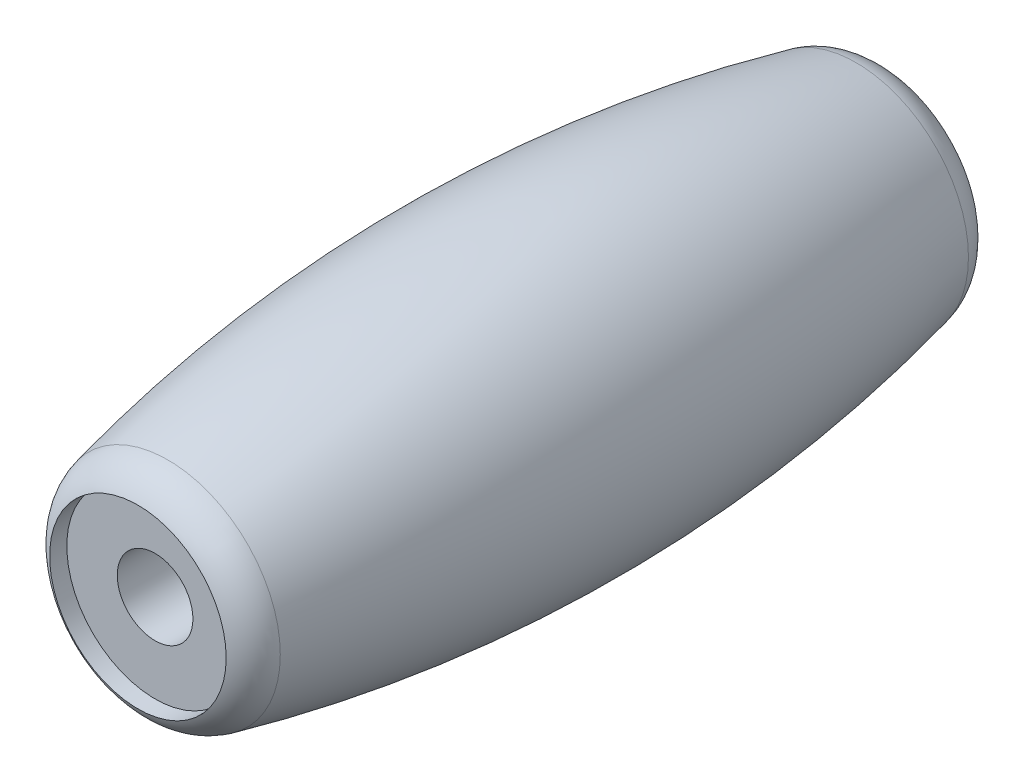
ISO-10303-21;
HEADER;
FILE_DESCRIPTION(('STEP AP214'),'2;1');
FILE_NAME('part.step','',(''),(''),'','','');
FILE_SCHEMA(('AUTOMOTIVE_DESIGN { 1 0 10303 214 1 1 1 1 }'));
ENDSEC;
DATA;
#1=APPLICATION_CONTEXT('core data for automotive mechanical design processes');
#2=APPLICATION_PROTOCOL_DEFINITION('international standard','automotive_design',2000,#1);
#3=PRODUCT_CONTEXT('',#1,'mechanical');
#4=PRODUCT('Part','Part','',(#3));
#5=PRODUCT_RELATED_PRODUCT_CATEGORY('part','',(#4));
#6=PRODUCT_DEFINITION_FORMATION('','',#4);
#7=PRODUCT_DEFINITION_CONTEXT('part definition',#1,'design');
#8=PRODUCT_DEFINITION('design','',#6,#7);
#9=PRODUCT_DEFINITION_SHAPE('','',#8);
#10=(LENGTH_UNIT() NAMED_UNIT(*) SI_UNIT(.MILLI.,.METRE.));
#11=(NAMED_UNIT(*) PLANE_ANGLE_UNIT() SI_UNIT($,.RADIAN.));
#12=(NAMED_UNIT(*) SI_UNIT($,.STERADIAN.) SOLID_ANGLE_UNIT());
#13=UNCERTAINTY_MEASURE_WITH_UNIT(LENGTH_MEASURE(1.E-05),#10,'distance_accuracy_value','');
#14=(GEOMETRIC_REPRESENTATION_CONTEXT(3) GLOBAL_UNCERTAINTY_ASSIGNED_CONTEXT((#13)) GLOBAL_UNIT_ASSIGNED_CONTEXT((#10,
#11,#12)) REPRESENTATION_CONTEXT('',''));
#15=CARTESIAN_POINT('',(0.,0.,0.));
#16=DIRECTION('',(0.,0.,1.));
#17=DIRECTION('',(1.,0.,0.));
#18=AXIS2_PLACEMENT_3D('',#15,#16,#17);
#19=CARTESIAN_POINT('',(0.,0.,13.25));
#20=DIRECTION('',(0.,0.,1.));
#21=DIRECTION('',(1.,0.,0.));
#22=AXIS2_PLACEMENT_3D('',#19,#20,#21);
#23=TOROIDAL_SURFACE('',#22,2.75000000000001,1.75000000000002);
#24=CARTESIAN_POINT('',(0.,0.,14.8311388300842));
#25=DIRECTION('',(0.,0.,1.));
#26=DIRECTION('',(1.,0.,0.));
#27=AXIS2_PLACEMENT_3D('',#24,#25,#26);
#28=CIRCLE('',#27,3.5);
#29=CARTESIAN_POINT('',(3.5,0.,14.8311388300842));
#30=VERTEX_POINT('',#29);
#31=EDGE_CURVE('E69',#30,#30,#28,.T.);
#32=ORIENTED_EDGE('',*,*,#31,.F.);
#33=EDGE_LOOP('',(#32));
#34=FACE_BOUND('',#33,.T.);
#35=CARTESIAN_POINT('',(0.,0.,13.6412126537786));
#36=DIRECTION('',(0.,0.,1.));
#37=DIRECTION('',(1.,0.,0.));
#38=AXIS2_PLACEMENT_3D('',#35,#36,#37);
#39=CIRCLE('',#38,4.45571177504395);
#40=CARTESIAN_POINT('',(4.45571177504395,0.,13.6412126537786));
#41=VERTEX_POINT('',#40);
#42=EDGE_CURVE('E10',#41,#41,#39,.T.);
#43=ORIENTED_EDGE('',*,*,#42,.T.);
#44=EDGE_LOOP('',(#43));
#45=FACE_BOUND('',#44,.T.);
#46=ADVANCED_FACE('F41',(#34,#45),#23,.T.);
#47=CARTESIAN_POINT('',(0.,0.,0.));
#48=DIRECTION('',(0.,0.,1.));
#49=DIRECTION('',(1.,0.,0.));
#50=AXIS2_PLACEMENT_3D('',#47,#48,#49);
#51=DEGENERATE_TOROIDAL_SURFACE('',#50,55.0208333333333,61.0208333333334,.F.);
#52=ORIENTED_EDGE('',*,*,#42,.F.);
#53=EDGE_LOOP('',(#52));
#54=FACE_BOUND('',#53,.T.);
#55=CARTESIAN_POINT('',(0.,0.,-13.6412126537786));
#56=DIRECTION('',(0.,0.,1.));
#57=DIRECTION('',(1.,0.,0.));
#58=AXIS2_PLACEMENT_3D('',#55,#56,#57);
#59=CIRCLE('',#58,4.45571177504395);
#60=CARTESIAN_POINT('',(4.45571177504395,0.,-13.6412126537786));
#61=VERTEX_POINT('',#60);
#62=EDGE_CURVE('E50',#61,#61,#59,.T.);
#63=ORIENTED_EDGE('',*,*,#62,.T.);
#64=EDGE_LOOP('',(#63));
#65=FACE_BOUND('',#64,.T.);
#66=ADVANCED_FACE('F78',(#54,#65),#51,.F.);
#67=CARTESIAN_POINT('',(0.,0.,-13.25));
#68=DIRECTION('',(0.,0.,1.));
#69=DIRECTION('',(1.,0.,0.));
#70=AXIS2_PLACEMENT_3D('',#67,#68,#69);
#71=TOROIDAL_SURFACE('',#70,2.74999999999999,1.75000000000003);
#72=ORIENTED_EDGE('',*,*,#62,.F.);
#73=EDGE_LOOP('',(#72));
#74=FACE_BOUND('',#73,.T.);
#75=CARTESIAN_POINT('',(0.,0.,-14.8311388300842));
#76=DIRECTION('',(0.,0.,1.));
#77=DIRECTION('',(1.,0.,0.));
#78=AXIS2_PLACEMENT_3D('',#75,#76,#77);
#79=CIRCLE('',#78,3.5);
#80=CARTESIAN_POINT('',(3.5,0.,-14.8311388300842));
#81=VERTEX_POINT('',#80);
#82=EDGE_CURVE('E51',#81,#81,#79,.T.);
#83=ORIENTED_EDGE('',*,*,#82,.T.);
#84=EDGE_LOOP('',(#83));
#85=FACE_BOUND('',#84,.T.);
#86=ADVANCED_FACE('F79',(#74,#85),#71,.T.);
#87=CARTESIAN_POINT('',(0.,0.,15.));
#88=DIRECTION('',(0.,0.,1.));
#89=DIRECTION('',(1.,0.,0.));
#90=AXIS2_PLACEMENT_3D('',#87,#88,#89);
#91=CYLINDRICAL_SURFACE('',#90,3.5);
#92=ORIENTED_EDGE('',*,*,#82,.F.);
#93=EDGE_LOOP('',(#92));
#94=FACE_BOUND('',#93,.T.);
#95=CARTESIAN_POINT('',(0.,0.,-14.15));
#96=DIRECTION('',(0.,0.,1.));
#97=DIRECTION('',(1.,0.,0.));
#98=AXIS2_PLACEMENT_3D('',#95,#96,#97);
#99=CIRCLE('',#98,3.5);
#100=CARTESIAN_POINT('',(3.5,0.,-14.15));
#101=VERTEX_POINT('',#100);
#102=EDGE_CURVE('E54',#101,#101,#99,.T.);
#103=ORIENTED_EDGE('',*,*,#102,.T.);
#104=EDGE_LOOP('',(#103));
#105=FACE_BOUND('',#104,.T.);
#106=ADVANCED_FACE('F82',(#94,#105),#91,.F.);
#107=CARTESIAN_POINT('',(0.,1.5,-14.15));
#108=DIRECTION('',(0.,0.,1.));
#109=DIRECTION('',(1.,0.,0.));
#110=AXIS2_PLACEMENT_3D('',#107,#108,#109);
#111=PLANE('',#110);
#112=ORIENTED_EDGE('',*,*,#102,.F.);
#113=EDGE_LOOP('',(#112));
#114=FACE_BOUND('',#113,.T.);
#115=CARTESIAN_POINT('',(0.,0.,-14.15));
#116=DIRECTION('',(0.,0.,1.));
#117=DIRECTION('',(1.,0.,0.));
#118=AXIS2_PLACEMENT_3D('',#115,#116,#117);
#119=CIRCLE('',#118,1.5);
#120=CARTESIAN_POINT('',(1.5,0.,-14.15));
#121=VERTEX_POINT('',#120);
#122=EDGE_CURVE('E58',#121,#121,#119,.T.);
#123=ORIENTED_EDGE('',*,*,#122,.T.);
#124=EDGE_LOOP('',(#123));
#125=FACE_BOUND('',#124,.T.);
#126=ADVANCED_FACE('F91',(#114,#125),#111,.F.);
#127=CARTESIAN_POINT('',(0.,0.,15.));
#128=DIRECTION('',(0.,0.,1.));
#129=DIRECTION('',(1.,0.,0.));
#130=AXIS2_PLACEMENT_3D('',#127,#128,#129);
#131=CYLINDRICAL_SURFACE('',#130,1.5);
#132=ORIENTED_EDGE('',*,*,#122,.F.);
#133=EDGE_LOOP('',(#132));
#134=FACE_BOUND('',#133,.T.);
#135=CARTESIAN_POINT('',(0.,0.,14.15));
#136=DIRECTION('',(0.,0.,1.));
#137=DIRECTION('',(1.,0.,0.));
#138=AXIS2_PLACEMENT_3D('',#135,#136,#137);
#139=CIRCLE('',#138,1.5);
#140=CARTESIAN_POINT('',(1.5,0.,14.15));
#141=VERTEX_POINT('',#140);
#142=EDGE_CURVE('E64',#141,#141,#139,.T.);
#143=ORIENTED_EDGE('',*,*,#142,.T.);
#144=EDGE_LOOP('',(#143));
#145=FACE_BOUND('',#144,.T.);
#146=ADVANCED_FACE('F94',(#134,#145),#131,.F.);
#147=CARTESIAN_POINT('',(0.,1.5,14.15));
#148=DIRECTION('',(0.,0.,-1.));
#149=DIRECTION('',(-1.,0.,0.));
#150=AXIS2_PLACEMENT_3D('',#147,#148,#149);
#151=PLANE('',#150);
#152=ORIENTED_EDGE('',*,*,#142,.F.);
#153=EDGE_LOOP('',(#152));
#154=FACE_BOUND('',#153,.T.);
#155=CARTESIAN_POINT('',(0.,0.,14.15));
#156=DIRECTION('',(0.,0.,1.));
#157=DIRECTION('',(1.,0.,0.));
#158=AXIS2_PLACEMENT_3D('',#155,#156,#157);
#159=CIRCLE('',#158,3.5);
#160=CARTESIAN_POINT('',(3.5,0.,14.15));
#161=VERTEX_POINT('',#160);
#162=EDGE_CURVE('E67',#161,#161,#159,.T.);
#163=ORIENTED_EDGE('',*,*,#162,.T.);
#164=EDGE_LOOP('',(#163));
#165=FACE_BOUND('',#164,.T.);
#166=ADVANCED_FACE('F98',(#154,#165),#151,.F.);
#167=CARTESIAN_POINT('',(0.,0.,15.));
#168=DIRECTION('',(0.,0.,1.));
#169=DIRECTION('',(1.,0.,0.));
#170=AXIS2_PLACEMENT_3D('',#167,#168,#169);
#171=CYLINDRICAL_SURFACE('',#170,3.5);
#172=ORIENTED_EDGE('',*,*,#162,.F.);
#173=EDGE_LOOP('',(#172));
#174=FACE_BOUND('',#173,.T.);
#175=ORIENTED_EDGE('',*,*,#31,.T.);
#176=EDGE_LOOP('',(#175));
#177=FACE_BOUND('',#176,.T.);
#178=ADVANCED_FACE('F74',(#174,#177),#171,.F.);
#179=CLOSED_SHELL('',(#46,#66,#86,#106,#126,#146,#166,#178));
#180=MANIFOLD_SOLID_BREP('B2',#179);
#181=ADVANCED_BREP_SHAPE_REPRESENTATION('',(#18,#180),#14);
#182=SHAPE_DEFINITION_REPRESENTATION(#9,#181);
ENDSEC;
END-ISO-10303-21;
